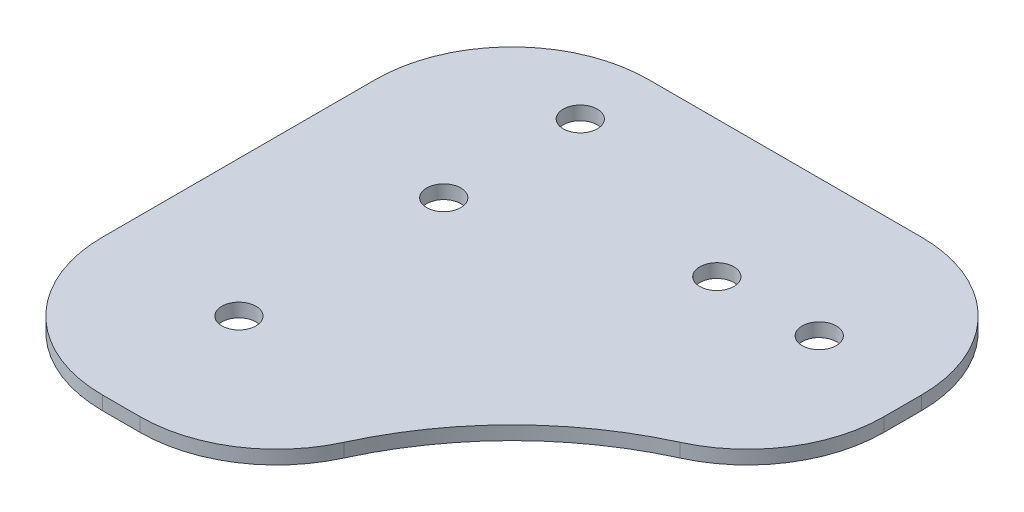
ISO-10303-21;
HEADER;
FILE_DESCRIPTION(('STEP AP214'),'2;1');
FILE_NAME('part.step','',(''),(''),'','','');
FILE_SCHEMA(('AUTOMOTIVE_DESIGN { 1 0 10303 214 1 1 1 1 }'));
ENDSEC;
DATA;
#1=APPLICATION_CONTEXT('core data for automotive mechanical design processes');
#2=APPLICATION_PROTOCOL_DEFINITION('international standard','automotive_design',2000,#1);
#3=PRODUCT_CONTEXT('',#1,'mechanical');
#4=PRODUCT('Part','Part','',(#3));
#5=PRODUCT_RELATED_PRODUCT_CATEGORY('part','',(#4));
#6=PRODUCT_DEFINITION_FORMATION('','',#4);
#7=PRODUCT_DEFINITION_CONTEXT('part definition',#1,'design');
#8=PRODUCT_DEFINITION('design','',#6,#7);
#9=PRODUCT_DEFINITION_SHAPE('','',#8);
#10=(LENGTH_UNIT() NAMED_UNIT(*) SI_UNIT(.MILLI.,.METRE.));
#11=(NAMED_UNIT(*) PLANE_ANGLE_UNIT() SI_UNIT($,.RADIAN.));
#12=(NAMED_UNIT(*) SI_UNIT($,.STERADIAN.) SOLID_ANGLE_UNIT());
#13=UNCERTAINTY_MEASURE_WITH_UNIT(LENGTH_MEASURE(1.E-05),#10,'distance_accuracy_value','');
#14=(GEOMETRIC_REPRESENTATION_CONTEXT(3) GLOBAL_UNCERTAINTY_ASSIGNED_CONTEXT((#13)) GLOBAL_UNIT_ASSIGNED_CONTEXT((#10,
#11,#12)) REPRESENTATION_CONTEXT('',''));
#15=CARTESIAN_POINT('',(0.,0.,0.));
#16=DIRECTION('',(0.,0.,1.));
#17=DIRECTION('',(1.,0.,0.));
#18=AXIS2_PLACEMENT_3D('',#15,#16,#17);
#19=CARTESIAN_POINT('',(0.,2.,-40.));
#20=DIRECTION('',(0.,0.,1.));
#21=DIRECTION('',(1.,0.,0.));
#22=AXIS2_PLACEMENT_3D('',#19,#20,#21);
#23=PLANE('',#22);
#24=DIRECTION('',(-1.,0.,0.));
#25=VECTOR('',#24,1.);
#26=CARTESIAN_POINT('',(0.,0.,-40.));
#27=LINE('',#26,#25);
#28=CARTESIAN_POINT('',(60.,0.,-40.));
#29=VERTEX_POINT('',#28);
#30=CARTESIAN_POINT('',(20.,0.,-40.));
#31=VERTEX_POINT('',#30);
#32=EDGE_CURVE('E141',#29,#31,#27,.T.);
#33=ORIENTED_EDGE('',*,*,#32,.T.);
#34=DIRECTION('',(0.,-1.,0.));
#35=VECTOR('',#34,1.);
#36=CARTESIAN_POINT('',(20.,2.,-40.));
#37=LINE('',#36,#35);
#38=CARTESIAN_POINT('',(20.,2.,-40.));
#39=VERTEX_POINT('',#38);
#40=EDGE_CURVE('E118',#31,#39,#37,.F.);
#41=ORIENTED_EDGE('',*,*,#40,.T.);
#42=DIRECTION('',(-1.,0.,0.));
#43=VECTOR('',#42,1.);
#44=CARTESIAN_POINT('',(0.,2.,-40.));
#45=LINE('',#44,#43);
#46=CARTESIAN_POINT('',(60.,2.,-40.));
#47=VERTEX_POINT('',#46);
#48=EDGE_CURVE('E222',#47,#39,#45,.T.);
#49=ORIENTED_EDGE('',*,*,#48,.F.);
#50=DIRECTION('',(0.,-1.,0.));
#51=VECTOR('',#50,1.);
#52=CARTESIAN_POINT('',(60.,0.,-40.));
#53=LINE('',#52,#51);
#54=EDGE_CURVE('E123',#47,#29,#53,.T.);
#55=ORIENTED_EDGE('',*,*,#54,.T.);
#56=EDGE_LOOP('',(#33,#41,#49,#55));
#57=FACE_BOUND('',#56,.T.);
#58=ADVANCED_FACE('F35',(#57),#23,.F.);
#59=CARTESIAN_POINT('',(0.,2.,0.));
#60=DIRECTION('',(1.,0.,0.));
#61=DIRECTION('',(0.,0.,-1.));
#62=AXIS2_PLACEMENT_3D('',#59,#60,#61);
#63=PLANE('',#62);
#64=DIRECTION('',(0.,0.,1.));
#65=VECTOR('',#64,1.);
#66=CARTESIAN_POINT('',(0.,2.,0.));
#67=LINE('',#66,#65);
#68=CARTESIAN_POINT('',(0.,2.,-20.));
#69=VERTEX_POINT('',#68);
#70=CARTESIAN_POINT('',(0.,2.,20.));
#71=VERTEX_POINT('',#70);
#72=EDGE_CURVE('E133',#69,#71,#67,.T.);
#73=ORIENTED_EDGE('',*,*,#72,.F.);
#74=DIRECTION('',(0.,-1.,0.));
#75=VECTOR('',#74,1.);
#76=CARTESIAN_POINT('',(0.,2.,-20.));
#77=LINE('',#76,#75);
#78=CARTESIAN_POINT('',(0.,0.,-20.));
#79=VERTEX_POINT('',#78);
#80=EDGE_CURVE('E117',#69,#79,#77,.T.);
#81=ORIENTED_EDGE('',*,*,#80,.T.);
#82=DIRECTION('',(0.,0.,1.));
#83=VECTOR('',#82,1.);
#84=CARTESIAN_POINT('',(0.,0.,0.));
#85=LINE('',#84,#83);
#86=CARTESIAN_POINT('',(0.,0.,20.));
#87=VERTEX_POINT('',#86);
#88=EDGE_CURVE('E130',#79,#87,#85,.T.);
#89=ORIENTED_EDGE('',*,*,#88,.T.);
#90=DIRECTION('',(0.,-1.,0.));
#91=VECTOR('',#90,1.);
#92=CARTESIAN_POINT('',(0.,2.,20.));
#93=LINE('',#92,#91);
#94=EDGE_CURVE('E135',#87,#71,#93,.F.);
#95=ORIENTED_EDGE('',*,*,#94,.T.);
#96=EDGE_LOOP('',(#73,#81,#89,#95));
#97=FACE_BOUND('',#96,.T.);
#98=ADVANCED_FACE('F129',(#97),#63,.F.);
#99=CARTESIAN_POINT('',(0.,2.,40.));
#100=DIRECTION('',(0.,0.,-1.));
#101=DIRECTION('',(-1.,0.,0.));
#102=AXIS2_PLACEMENT_3D('',#99,#100,#101);
#103=PLANE('',#102);
#104=DIRECTION('',(1.,0.,0.));
#105=VECTOR('',#104,1.);
#106=CARTESIAN_POINT('',(0.,0.,40.));
#107=LINE('',#106,#105);
#108=CARTESIAN_POINT('',(20.,0.,40.));
#109=VERTEX_POINT('',#108);
#110=CARTESIAN_POINT('',(25.5151491674372,0.,40.));
#111=VERTEX_POINT('',#110);
#112=EDGE_CURVE('E140',#109,#111,#107,.T.);
#113=ORIENTED_EDGE('',*,*,#112,.T.);
#114=DIRECTION('',(0.,1.,0.));
#115=VECTOR('',#114,1.);
#116=CARTESIAN_POINT('',(25.5151491674372,2.,40.));
#117=LINE('',#116,#115);
#118=CARTESIAN_POINT('',(25.5151491674372,2.,40.));
#119=VERTEX_POINT('',#118);
#120=EDGE_CURVE('E11',#111,#119,#117,.T.);
#121=ORIENTED_EDGE('',*,*,#120,.T.);
#122=DIRECTION('',(1.,0.,0.));
#123=VECTOR('',#122,1.);
#124=CARTESIAN_POINT('',(0.,2.,40.));
#125=LINE('',#124,#123);
#126=CARTESIAN_POINT('',(20.,2.,40.));
#127=VERTEX_POINT('',#126);
#128=EDGE_CURVE('E196',#127,#119,#125,.T.);
#129=ORIENTED_EDGE('',*,*,#128,.F.);
#130=DIRECTION('',(0.,-1.,0.));
#131=VECTOR('',#130,1.);
#132=CARTESIAN_POINT('',(20.,2.,40.));
#133=LINE('',#132,#131);
#134=EDGE_CURVE('E43',#127,#109,#133,.T.);
#135=ORIENTED_EDGE('',*,*,#134,.T.);
#136=EDGE_LOOP('',(#113,#121,#129,#135));
#137=FACE_BOUND('',#136,.T.);
#138=ADVANCED_FACE('F193',(#137),#103,.F.);
#139=CARTESIAN_POINT('',(80.,2.,0.));
#140=DIRECTION('',(1.,0.,0.));
#141=DIRECTION('',(0.,0.,-1.));
#142=AXIS2_PLACEMENT_3D('',#139,#140,#141);
#143=PLANE('',#142);
#144=DIRECTION('',(0.,0.,1.));
#145=VECTOR('',#144,1.);
#146=CARTESIAN_POINT('',(80.,0.,0.));
#147=LINE('',#146,#145);
#148=CARTESIAN_POINT('',(80.,0.,-20.));
#149=VERTEX_POINT('',#148);
#150=CARTESIAN_POINT('',(80.,0.,-14.4848508325628));
#151=VERTEX_POINT('',#150);
#152=EDGE_CURVE('E144',#149,#151,#147,.T.);
#153=ORIENTED_EDGE('',*,*,#152,.F.);
#154=DIRECTION('',(0.,-1.,0.));
#155=VECTOR('',#154,1.);
#156=CARTESIAN_POINT('',(80.,2.,-20.));
#157=LINE('',#156,#155);
#158=CARTESIAN_POINT('',(80.,2.,-20.));
#159=VERTEX_POINT('',#158);
#160=EDGE_CURVE('E57',#149,#159,#157,.F.);
#161=ORIENTED_EDGE('',*,*,#160,.T.);
#162=DIRECTION('',(0.,0.,1.));
#163=VECTOR('',#162,1.);
#164=CARTESIAN_POINT('',(80.,2.,0.));
#165=LINE('',#164,#163);
#166=CARTESIAN_POINT('',(80.,2.,-14.4848508325628));
#167=VERTEX_POINT('',#166);
#168=EDGE_CURVE('E215',#159,#167,#165,.T.);
#169=ORIENTED_EDGE('',*,*,#168,.T.);
#170=DIRECTION('',(0.,-1.,0.));
#171=VECTOR('',#170,1.);
#172=CARTESIAN_POINT('',(80.,0.,-14.4848508325628));
#173=LINE('',#172,#171);
#174=EDGE_CURVE('E181',#167,#151,#173,.T.);
#175=ORIENTED_EDGE('',*,*,#174,.T.);
#176=EDGE_LOOP('',(#153,#161,#169,#175));
#177=FACE_BOUND('',#176,.T.);
#178=ADVANCED_FACE('F214',(#177),#143,.T.);
#179=CARTESIAN_POINT('',(20.,2.,-10.));
#180=DIRECTION('',(0.,-1.,0.));
#181=DIRECTION('',(0.,0.,-1.));
#182=AXIS2_PLACEMENT_3D('',#179,#180,#181);
#183=CYLINDRICAL_SURFACE('',#182,2.5);
#184=CARTESIAN_POINT('',(20.,2.,-10.));
#185=DIRECTION('',(0.,1.,0.));
#186=DIRECTION('',(0.,0.,1.));
#187=AXIS2_PLACEMENT_3D('',#184,#185,#186);
#188=CIRCLE('',#187,2.5);
#189=CARTESIAN_POINT('',(20.,2.,-7.5));
#190=VERTEX_POINT('',#189);
#191=EDGE_CURVE('E223',#190,#190,#188,.T.);
#192=ORIENTED_EDGE('',*,*,#191,.T.);
#193=EDGE_LOOP('',(#192));
#194=FACE_BOUND('',#193,.T.);
#195=CARTESIAN_POINT('',(20.,0.,-10.));
#196=DIRECTION('',(0.,1.,0.));
#197=DIRECTION('',(0.,0.,1.));
#198=AXIS2_PLACEMENT_3D('',#195,#196,#197);
#199=CIRCLE('',#198,2.5);
#200=CARTESIAN_POINT('',(20.,0.,-7.5));
#201=VERTEX_POINT('',#200);
#202=EDGE_CURVE('E146',#201,#201,#199,.T.);
#203=ORIENTED_EDGE('',*,*,#202,.F.);
#204=EDGE_LOOP('',(#203));
#205=FACE_BOUND('',#204,.T.);
#206=ADVANCED_FACE('F247',(#194,#205),#183,.F.);
#207=CARTESIAN_POINT('',(65.,2.,-20.));
#208=DIRECTION('',(0.,-1.,0.));
#209=DIRECTION('',(0.,0.,-1.));
#210=AXIS2_PLACEMENT_3D('',#207,#208,#209);
#211=CYLINDRICAL_SURFACE('',#210,2.5);
#212=CARTESIAN_POINT('',(65.,2.,-20.));
#213=DIRECTION('',(0.,1.,0.));
#214=DIRECTION('',(0.,0.,1.));
#215=AXIS2_PLACEMENT_3D('',#212,#213,#214);
#216=CIRCLE('',#215,2.5);
#217=CARTESIAN_POINT('',(65.,2.,-17.5));
#218=VERTEX_POINT('',#217);
#219=EDGE_CURVE('E227',#218,#218,#216,.T.);
#220=ORIENTED_EDGE('',*,*,#219,.T.);
#221=EDGE_LOOP('',(#220));
#222=FACE_BOUND('',#221,.T.);
#223=CARTESIAN_POINT('',(65.,0.,-20.));
#224=DIRECTION('',(0.,1.,0.));
#225=DIRECTION('',(0.,0.,1.));
#226=AXIS2_PLACEMENT_3D('',#223,#224,#225);
#227=CIRCLE('',#226,2.5);
#228=CARTESIAN_POINT('',(65.,0.,-17.5));
#229=VERTEX_POINT('',#228);
#230=EDGE_CURVE('E241',#229,#229,#227,.T.);
#231=ORIENTED_EDGE('',*,*,#230,.F.);
#232=EDGE_LOOP('',(#231));
#233=FACE_BOUND('',#232,.T.);
#234=ADVANCED_FACE('F249',(#222,#233),#211,.F.);
#235=CARTESIAN_POINT('',(50.,2.,-20.));
#236=DIRECTION('',(0.,-1.,0.));
#237=DIRECTION('',(0.,0.,-1.));
#238=AXIS2_PLACEMENT_3D('',#235,#236,#237);
#239=CYLINDRICAL_SURFACE('',#238,2.5);
#240=CARTESIAN_POINT('',(50.,2.,-20.));
#241=DIRECTION('',(0.,1.,0.));
#242=DIRECTION('',(0.,0.,1.));
#243=AXIS2_PLACEMENT_3D('',#240,#241,#242);
#244=CIRCLE('',#243,2.5);
#245=CARTESIAN_POINT('',(50.,2.,-17.5));
#246=VERTEX_POINT('',#245);
#247=EDGE_CURVE('E289',#246,#246,#244,.T.);
#248=ORIENTED_EDGE('',*,*,#247,.T.);
#249=EDGE_LOOP('',(#248));
#250=FACE_BOUND('',#249,.T.);
#251=CARTESIAN_POINT('',(50.,0.,-20.));
#252=DIRECTION('',(0.,1.,0.));
#253=DIRECTION('',(0.,0.,1.));
#254=AXIS2_PLACEMENT_3D('',#251,#252,#253);
#255=CIRCLE('',#254,2.5);
#256=CARTESIAN_POINT('',(50.,0.,-17.5));
#257=VERTEX_POINT('',#256);
#258=EDGE_CURVE('E238',#257,#257,#255,.T.);
#259=ORIENTED_EDGE('',*,*,#258,.F.);
#260=EDGE_LOOP('',(#259));
#261=FACE_BOUND('',#260,.T.);
#262=ADVANCED_FACE('F256',(#250,#261),#239,.F.);
#263=CARTESIAN_POINT('',(20.,2.,-30.));
#264=DIRECTION('',(0.,-1.,0.));
#265=DIRECTION('',(0.,0.,-1.));
#266=AXIS2_PLACEMENT_3D('',#263,#264,#265);
#267=CYLINDRICAL_SURFACE('',#266,2.5);
#268=CARTESIAN_POINT('',(20.,2.,-30.));
#269=DIRECTION('',(0.,1.,0.));
#270=DIRECTION('',(0.,0.,1.));
#271=AXIS2_PLACEMENT_3D('',#268,#269,#270);
#272=CIRCLE('',#271,2.5);
#273=CARTESIAN_POINT('',(20.,2.,-27.5));
#274=VERTEX_POINT('',#273);
#275=EDGE_CURVE('E155',#274,#274,#272,.T.);
#276=ORIENTED_EDGE('',*,*,#275,.T.);
#277=EDGE_LOOP('',(#276));
#278=FACE_BOUND('',#277,.T.);
#279=CARTESIAN_POINT('',(20.,0.,-30.));
#280=DIRECTION('',(0.,1.,0.));
#281=DIRECTION('',(0.,0.,1.));
#282=AXIS2_PLACEMENT_3D('',#279,#280,#281);
#283=CIRCLE('',#282,2.5);
#284=CARTESIAN_POINT('',(20.,0.,-27.5));
#285=VERTEX_POINT('',#284);
#286=EDGE_CURVE('E235',#285,#285,#283,.T.);
#287=ORIENTED_EDGE('',*,*,#286,.F.);
#288=EDGE_LOOP('',(#287));
#289=FACE_BOUND('',#288,.T.);
#290=ADVANCED_FACE('F274',(#278,#289),#267,.F.);
#291=CARTESIAN_POINT('',(20.,2.,20.));
#292=DIRECTION('',(0.,-1.,0.));
#293=DIRECTION('',(0.,0.,-1.));
#294=AXIS2_PLACEMENT_3D('',#291,#292,#293);
#295=CYLINDRICAL_SURFACE('',#294,2.5);
#296=CARTESIAN_POINT('',(20.,2.,20.));
#297=DIRECTION('',(0.,1.,0.));
#298=DIRECTION('',(0.,0.,1.));
#299=AXIS2_PLACEMENT_3D('',#296,#297,#298);
#300=CIRCLE('',#299,2.5);
#301=CARTESIAN_POINT('',(20.,2.,22.5));
#302=VERTEX_POINT('',#301);
#303=EDGE_CURVE('E160',#302,#302,#300,.T.);
#304=ORIENTED_EDGE('',*,*,#303,.T.);
#305=EDGE_LOOP('',(#304));
#306=FACE_BOUND('',#305,.T.);
#307=CARTESIAN_POINT('',(20.,0.,20.));
#308=DIRECTION('',(0.,1.,0.));
#309=DIRECTION('',(0.,0.,1.));
#310=AXIS2_PLACEMENT_3D('',#307,#308,#309);
#311=CIRCLE('',#310,2.5);
#312=CARTESIAN_POINT('',(20.,0.,22.5));
#313=VERTEX_POINT('',#312);
#314=EDGE_CURVE('E152',#313,#313,#311,.T.);
#315=ORIENTED_EDGE('',*,*,#314,.F.);
#316=EDGE_LOOP('',(#315));
#317=FACE_BOUND('',#316,.T.);
#318=ADVANCED_FACE('F271',(#306,#317),#295,.F.);
#319=CARTESIAN_POINT('',(0.,2.,0.));
#320=DIRECTION('',(0.,1.,0.));
#321=DIRECTION('',(0.,0.,1.));
#322=AXIS2_PLACEMENT_3D('',#319,#320,#321);
#323=PLANE('',#322);
#324=ORIENTED_EDGE('',*,*,#275,.F.);
#325=EDGE_LOOP('',(#324));
#326=FACE_BOUND('',#325,.T.);
#327=ORIENTED_EDGE('',*,*,#247,.F.);
#328=EDGE_LOOP('',(#327));
#329=FACE_BOUND('',#328,.T.);
#330=ORIENTED_EDGE('',*,*,#219,.F.);
#331=EDGE_LOOP('',(#330));
#332=FACE_BOUND('',#331,.T.);
#333=ORIENTED_EDGE('',*,*,#191,.F.);
#334=EDGE_LOOP('',(#333));
#335=FACE_BOUND('',#334,.T.);
#336=ORIENTED_EDGE('',*,*,#48,.T.);
#337=CARTESIAN_POINT('',(20.,2.,-20.));
#338=DIRECTION('',(0.,1.,0.));
#339=DIRECTION('',(0.,0.,1.));
#340=AXIS2_PLACEMENT_3D('',#337,#338,#339);
#341=CIRCLE('',#340,20.);
#342=EDGE_CURVE('E179',#39,#69,#341,.T.);
#343=ORIENTED_EDGE('',*,*,#342,.T.);
#344=ORIENTED_EDGE('',*,*,#72,.T.);
#345=CARTESIAN_POINT('',(20.,2.,20.));
#346=DIRECTION('',(0.,1.,0.));
#347=DIRECTION('',(0.,0.,1.));
#348=AXIS2_PLACEMENT_3D('',#345,#346,#347);
#349=CIRCLE('',#348,20.);
#350=EDGE_CURVE('E172',#71,#127,#349,.T.);
#351=ORIENTED_EDGE('',*,*,#350,.T.);
#352=ORIENTED_EDGE('',*,*,#128,.T.);
#353=CARTESIAN_POINT('',(25.5151491674372,2.,20.));
#354=DIRECTION('',(0.,1.,0.));
#355=DIRECTION('',(0.,0.,1.));
#356=AXIS2_PLACEMENT_3D('',#353,#354,#355);
#357=CIRCLE('',#356,20.);
#358=CARTESIAN_POINT('',(43.697894969377,2.,28.3299312783504));
#359=VERTEX_POINT('',#358);
#360=EDGE_CURVE('E174',#119,#359,#357,.T.);
#361=ORIENTED_EDGE('',*,*,#360,.T.);
#362=CARTESIAN_POINT('',(89.1547594742265,2.,49.1547594742265));
#363=DIRECTION('',(0.,1.,0.));
#364=DIRECTION('',(0.,0.,1.));
#365=AXIS2_PLACEMENT_3D('',#362,#363,#364);
#366=CIRCLE('',#365,50.);
#367=CARTESIAN_POINT('',(68.3299312783504,2.,3.69789496937702));
#368=VERTEX_POINT('',#367);
#369=EDGE_CURVE('E159',#359,#368,#366,.F.);
#370=ORIENTED_EDGE('',*,*,#369,.T.);
#371=CARTESIAN_POINT('',(60.,2.,-14.4848508325628));
#372=DIRECTION('',(0.,1.,0.));
#373=DIRECTION('',(0.,0.,1.));
#374=AXIS2_PLACEMENT_3D('',#371,#372,#373);
#375=CIRCLE('',#374,20.);
#376=EDGE_CURVE('E50',#368,#167,#375,.T.);
#377=ORIENTED_EDGE('',*,*,#376,.T.);
#378=ORIENTED_EDGE('',*,*,#168,.F.);
#379=CARTESIAN_POINT('',(60.,2.,-20.));
#380=DIRECTION('',(0.,1.,0.));
#381=DIRECTION('',(0.,0.,1.));
#382=AXIS2_PLACEMENT_3D('',#379,#380,#381);
#383=CIRCLE('',#382,20.);
#384=EDGE_CURVE('E177',#159,#47,#383,.T.);
#385=ORIENTED_EDGE('',*,*,#384,.T.);
#386=EDGE_LOOP('',(#336,#343,#344,#351,#352,#361,#370,#377,#378,#385));
#387=FACE_BOUND('',#386,.T.);
#388=ORIENTED_EDGE('',*,*,#303,.F.);
#389=EDGE_LOOP('',(#388));
#390=FACE_BOUND('',#389,.T.);
#391=ADVANCED_FACE('F209',(#326,#329,#332,#335,#387,#390),#323,.T.);
#392=CARTESIAN_POINT('',(0.,0.,0.));
#393=DIRECTION('',(0.,1.,0.));
#394=DIRECTION('',(0.,0.,1.));
#395=AXIS2_PLACEMENT_3D('',#392,#393,#394);
#396=PLANE('',#395);
#397=ORIENTED_EDGE('',*,*,#286,.T.);
#398=EDGE_LOOP('',(#397));
#399=FACE_BOUND('',#398,.T.);
#400=ORIENTED_EDGE('',*,*,#258,.T.);
#401=EDGE_LOOP('',(#400));
#402=FACE_BOUND('',#401,.T.);
#403=ORIENTED_EDGE('',*,*,#230,.T.);
#404=EDGE_LOOP('',(#403));
#405=FACE_BOUND('',#404,.T.);
#406=ORIENTED_EDGE('',*,*,#202,.T.);
#407=EDGE_LOOP('',(#406));
#408=FACE_BOUND('',#407,.T.);
#409=ORIENTED_EDGE('',*,*,#88,.F.);
#410=CARTESIAN_POINT('',(20.,0.,-20.));
#411=DIRECTION('',(0.,1.,0.));
#412=DIRECTION('',(0.,0.,1.));
#413=AXIS2_PLACEMENT_3D('',#410,#411,#412);
#414=CIRCLE('',#413,20.);
#415=EDGE_CURVE('E113',#79,#31,#414,.F.);
#416=ORIENTED_EDGE('',*,*,#415,.T.);
#417=ORIENTED_EDGE('',*,*,#32,.F.);
#418=CARTESIAN_POINT('',(60.,0.,-20.));
#419=DIRECTION('',(0.,1.,0.));
#420=DIRECTION('',(0.,0.,1.));
#421=AXIS2_PLACEMENT_3D('',#418,#419,#420);
#422=CIRCLE('',#421,20.);
#423=EDGE_CURVE('E124',#29,#149,#422,.F.);
#424=ORIENTED_EDGE('',*,*,#423,.T.);
#425=ORIENTED_EDGE('',*,*,#152,.T.);
#426=CARTESIAN_POINT('',(60.,0.,-14.4848508325628));
#427=DIRECTION('',(0.,1.,0.));
#428=DIRECTION('',(0.,0.,1.));
#429=AXIS2_PLACEMENT_3D('',#426,#427,#428);
#430=CIRCLE('',#429,20.);
#431=CARTESIAN_POINT('',(68.3299312783504,0.,3.69789496937702));
#432=VERTEX_POINT('',#431);
#433=EDGE_CURVE('E166',#151,#432,#430,.F.);
#434=ORIENTED_EDGE('',*,*,#433,.T.);
#435=CARTESIAN_POINT('',(89.1547594742265,0.,49.1547594742265));
#436=DIRECTION('',(0.,1.,0.));
#437=DIRECTION('',(0.,0.,1.));
#438=AXIS2_PLACEMENT_3D('',#435,#436,#437);
#439=CIRCLE('',#438,50.);
#440=CARTESIAN_POINT('',(43.697894969377,0.,28.3299312783504));
#441=VERTEX_POINT('',#440);
#442=EDGE_CURVE('E156',#432,#441,#439,.T.);
#443=ORIENTED_EDGE('',*,*,#442,.T.);
#444=CARTESIAN_POINT('',(25.5151491674372,0.,20.));
#445=DIRECTION('',(0.,1.,0.));
#446=DIRECTION('',(0.,0.,1.));
#447=AXIS2_PLACEMENT_3D('',#444,#445,#446);
#448=CIRCLE('',#447,20.);
#449=EDGE_CURVE('E164',#441,#111,#448,.F.);
#450=ORIENTED_EDGE('',*,*,#449,.T.);
#451=ORIENTED_EDGE('',*,*,#112,.F.);
#452=CARTESIAN_POINT('',(20.,0.,20.));
#453=DIRECTION('',(0.,1.,0.));
#454=DIRECTION('',(0.,0.,1.));
#455=AXIS2_PLACEMENT_3D('',#452,#453,#454);
#456=CIRCLE('',#455,20.);
#457=EDGE_CURVE('E134',#109,#87,#456,.F.);
#458=ORIENTED_EDGE('',*,*,#457,.T.);
#459=EDGE_LOOP('',(#409,#416,#417,#424,#425,#434,#443,#450,#451,#458));
#460=FACE_BOUND('',#459,.T.);
#461=ORIENTED_EDGE('',*,*,#314,.T.);
#462=EDGE_LOOP('',(#461));
#463=FACE_BOUND('',#462,.T.);
#464=ADVANCED_FACE('F137',(#399,#402,#405,#408,#460,#463),#396,.F.);
#465=CARTESIAN_POINT('',(89.1547594742265,2.,49.1547594742265));
#466=DIRECTION('',(0.,1.,0.));
#467=DIRECTION('',(0.,0.,1.));
#468=AXIS2_PLACEMENT_3D('',#465,#466,#467);
#469=CYLINDRICAL_SURFACE('',#468,50.);
#470=ORIENTED_EDGE('',*,*,#442,.F.);
#471=DIRECTION('',(0.,1.,0.));
#472=VECTOR('',#471,1.);
#473=CARTESIAN_POINT('',(68.3299312783504,2.,3.69789496937702));
#474=LINE('',#473,#472);
#475=EDGE_CURVE('E188',#432,#368,#474,.T.);
#476=ORIENTED_EDGE('',*,*,#475,.T.);
#477=ORIENTED_EDGE('',*,*,#369,.F.);
#478=DIRECTION('',(0.,1.,0.));
#479=VECTOR('',#478,1.);
#480=CARTESIAN_POINT('',(43.697894969377,2.,28.3299312783504));
#481=LINE('',#480,#479);
#482=EDGE_CURVE('E185',#359,#441,#481,.F.);
#483=ORIENTED_EDGE('',*,*,#482,.T.);
#484=EDGE_LOOP('',(#470,#476,#477,#483));
#485=FACE_BOUND('',#484,.T.);
#486=ADVANCED_FACE('F206',(#485),#469,.F.);
#487=CARTESIAN_POINT('',(20.,2.,-20.));
#488=DIRECTION('',(0.,-1.,0.));
#489=DIRECTION('',(0.,0.,-1.));
#490=AXIS2_PLACEMENT_3D('',#487,#488,#489);
#491=CYLINDRICAL_SURFACE('',#490,20.);
#492=ORIENTED_EDGE('',*,*,#342,.F.);
#493=ORIENTED_EDGE('',*,*,#40,.F.);
#494=ORIENTED_EDGE('',*,*,#415,.F.);
#495=ORIENTED_EDGE('',*,*,#80,.F.);
#496=EDGE_LOOP('',(#492,#493,#494,#495));
#497=FACE_BOUND('',#496,.T.);
#498=ADVANCED_FACE('F116',(#497),#491,.T.);
#499=CARTESIAN_POINT('',(60.,2.,-20.));
#500=DIRECTION('',(0.,1.,0.));
#501=DIRECTION('',(0.,0.,1.));
#502=AXIS2_PLACEMENT_3D('',#499,#500,#501);
#503=CYLINDRICAL_SURFACE('',#502,20.);
#504=ORIENTED_EDGE('',*,*,#384,.F.);
#505=ORIENTED_EDGE('',*,*,#160,.F.);
#506=ORIENTED_EDGE('',*,*,#423,.F.);
#507=ORIENTED_EDGE('',*,*,#54,.F.);
#508=EDGE_LOOP('',(#504,#505,#506,#507));
#509=FACE_BOUND('',#508,.T.);
#510=ADVANCED_FACE('F219',(#509),#503,.T.);
#511=CARTESIAN_POINT('',(60.,2.,-14.4848508325628));
#512=DIRECTION('',(0.,1.,0.));
#513=DIRECTION('',(0.,0.,1.));
#514=AXIS2_PLACEMENT_3D('',#511,#512,#513);
#515=CYLINDRICAL_SURFACE('',#514,20.);
#516=ORIENTED_EDGE('',*,*,#376,.F.);
#517=ORIENTED_EDGE('',*,*,#475,.F.);
#518=ORIENTED_EDGE('',*,*,#433,.F.);
#519=ORIENTED_EDGE('',*,*,#174,.F.);
#520=EDGE_LOOP('',(#516,#517,#518,#519));
#521=FACE_BOUND('',#520,.T.);
#522=ADVANCED_FACE('F213',(#521),#515,.T.);
#523=CARTESIAN_POINT('',(25.5151491674372,2.,20.));
#524=DIRECTION('',(0.,1.,0.));
#525=DIRECTION('',(0.,0.,1.));
#526=AXIS2_PLACEMENT_3D('',#523,#524,#525);
#527=CYLINDRICAL_SURFACE('',#526,20.);
#528=ORIENTED_EDGE('',*,*,#360,.F.);
#529=ORIENTED_EDGE('',*,*,#120,.F.);
#530=ORIENTED_EDGE('',*,*,#449,.F.);
#531=ORIENTED_EDGE('',*,*,#482,.F.);
#532=EDGE_LOOP('',(#528,#529,#530,#531));
#533=FACE_BOUND('',#532,.T.);
#534=ADVANCED_FACE('F203',(#533),#527,.T.);
#535=CARTESIAN_POINT('',(20.,2.,20.));
#536=DIRECTION('',(0.,-1.,0.));
#537=DIRECTION('',(0.,0.,-1.));
#538=AXIS2_PLACEMENT_3D('',#535,#536,#537);
#539=CYLINDRICAL_SURFACE('',#538,20.);
#540=ORIENTED_EDGE('',*,*,#350,.F.);
#541=ORIENTED_EDGE('',*,*,#94,.F.);
#542=ORIENTED_EDGE('',*,*,#457,.F.);
#543=ORIENTED_EDGE('',*,*,#134,.F.);
#544=EDGE_LOOP('',(#540,#541,#542,#543));
#545=FACE_BOUND('',#544,.T.);
#546=ADVANCED_FACE('F37',(#545),#539,.T.);
#547=CLOSED_SHELL('',(#58,#98,#138,#178,#206,#234,#262,#290,#318,#391,#464,#486,#498,#510,#522,
#534,#546));
#548=MANIFOLD_SOLID_BREP('B2',#547);
#549=ADVANCED_BREP_SHAPE_REPRESENTATION('',(#18,#548),#14);
#550=SHAPE_DEFINITION_REPRESENTATION(#9,#549);
ENDSEC;
END-ISO-10303-21;
